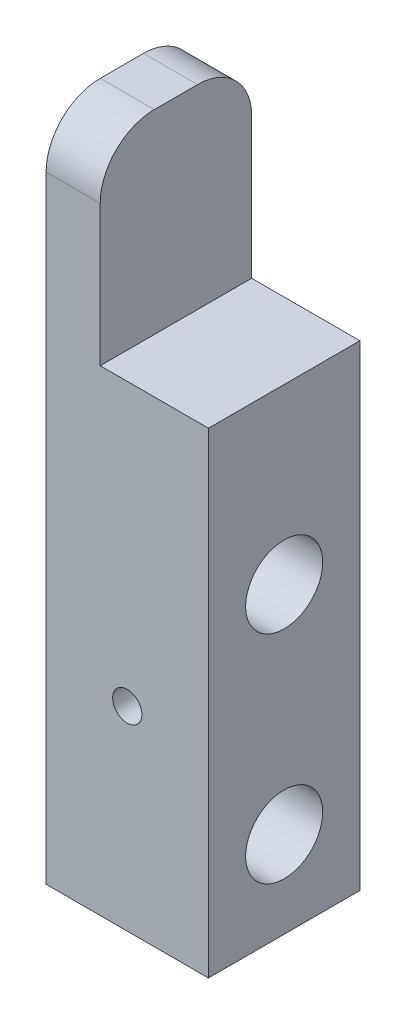
ISO-10303-21;
HEADER;
FILE_DESCRIPTION(('STEP AP214'),'2;1');
FILE_NAME('part.step','',(''),(''),'','','');
FILE_SCHEMA(('AUTOMOTIVE_DESIGN { 1 0 10303 214 1 1 1 1 }'));
ENDSEC;
DATA;
#1=APPLICATION_CONTEXT('core data for automotive mechanical design processes');
#2=APPLICATION_PROTOCOL_DEFINITION('international standard','automotive_design',2000,#1);
#3=PRODUCT_CONTEXT('',#1,'mechanical');
#4=PRODUCT('Part','Part','',(#3));
#5=PRODUCT_RELATED_PRODUCT_CATEGORY('part','',(#4));
#6=PRODUCT_DEFINITION_FORMATION('','',#4);
#7=PRODUCT_DEFINITION_CONTEXT('part definition',#1,'design');
#8=PRODUCT_DEFINITION('design','',#6,#7);
#9=PRODUCT_DEFINITION_SHAPE('','',#8);
#10=(LENGTH_UNIT() NAMED_UNIT(*) SI_UNIT(.MILLI.,.METRE.));
#11=(NAMED_UNIT(*) PLANE_ANGLE_UNIT() SI_UNIT($,.RADIAN.));
#12=(NAMED_UNIT(*) SI_UNIT($,.STERADIAN.) SOLID_ANGLE_UNIT());
#13=UNCERTAINTY_MEASURE_WITH_UNIT(LENGTH_MEASURE(1.E-05),#10,'distance_accuracy_value','');
#14=(GEOMETRIC_REPRESENTATION_CONTEXT(3) GLOBAL_UNCERTAINTY_ASSIGNED_CONTEXT((#13)) GLOBAL_UNIT_ASSIGNED_CONTEXT((#10,
#11,#12)) REPRESENTATION_CONTEXT('',''));
#15=CARTESIAN_POINT('',(0.,0.,0.));
#16=DIRECTION('',(0.,0.,1.));
#17=DIRECTION('',(1.,0.,0.));
#18=AXIS2_PLACEMENT_3D('',#15,#16,#17);
#19=CARTESIAN_POINT('',(-7.5,-18.,7.));
#20=DIRECTION('',(0.,1.,0.));
#21=DIRECTION('',(0.,0.,1.));
#22=AXIS2_PLACEMENT_3D('',#19,#20,#21);
#23=PLANE('',#22);
#24=DIRECTION('',(1.,0.,0.));
#25=VECTOR('',#24,1.);
#26=CARTESIAN_POINT('',(-7.5,-18.,-7.));
#27=LINE('',#26,#25);
#28=CARTESIAN_POINT('',(-7.5,-18.,-7.));
#29=VERTEX_POINT('',#28);
#30=CARTESIAN_POINT('',(7.5,-18.,-7.));
#31=VERTEX_POINT('',#30);
#32=EDGE_CURVE('E122',#29,#31,#27,.T.);
#33=ORIENTED_EDGE('',*,*,#32,.T.);
#34=DIRECTION('',(0.,0.,-1.));
#35=VECTOR('',#34,1.);
#36=CARTESIAN_POINT('',(7.5,-18.,7.));
#37=LINE('',#36,#35);
#38=CARTESIAN_POINT('',(7.5,-18.,7.));
#39=VERTEX_POINT('',#38);
#40=EDGE_CURVE('E106',#39,#31,#37,.T.);
#41=ORIENTED_EDGE('',*,*,#40,.F.);
#42=DIRECTION('',(1.,0.,0.));
#43=VECTOR('',#42,1.);
#44=CARTESIAN_POINT('',(-7.5,-18.,7.));
#45=LINE('',#44,#43);
#46=CARTESIAN_POINT('',(-7.5,-18.,7.));
#47=VERTEX_POINT('',#46);
#48=EDGE_CURVE('E112',#47,#39,#45,.T.);
#49=ORIENTED_EDGE('',*,*,#48,.F.);
#50=DIRECTION('',(0.,0.,-1.));
#51=VECTOR('',#50,1.);
#52=CARTESIAN_POINT('',(-7.5,-18.,7.));
#53=LINE('',#52,#51);
#54=EDGE_CURVE('E170',#47,#29,#53,.T.);
#55=ORIENTED_EDGE('',*,*,#54,.T.);
#56=EDGE_LOOP('',(#33,#41,#49,#55));
#57=FACE_BOUND('',#56,.T.);
#58=ADVANCED_FACE('F35',(#57),#23,.F.);
#59=CARTESIAN_POINT('',(7.5,23.,7.));
#60=DIRECTION('',(-1.,0.,0.));
#61=DIRECTION('',(0.,0.,1.));
#62=AXIS2_PLACEMENT_3D('',#59,#60,#61);
#63=PLANE('',#62);
#64=CARTESIAN_POINT('',(7.5,10.,0.));
#65=DIRECTION('',(1.,0.,0.));
#66=DIRECTION('',(0.,0.,-1.));
#67=AXIS2_PLACEMENT_3D('',#64,#65,#66);
#68=CIRCLE('',#67,3.56);
#69=CARTESIAN_POINT('',(7.5,10.,-3.56));
#70=VERTEX_POINT('',#69);
#71=EDGE_CURVE('E138',#70,#70,#68,.T.);
#72=ORIENTED_EDGE('',*,*,#71,.F.);
#73=EDGE_LOOP('',(#72));
#74=FACE_BOUND('',#73,.T.);
#75=CARTESIAN_POINT('',(7.5,-10.,0.));
#76=DIRECTION('',(1.,0.,0.));
#77=DIRECTION('',(0.,0.,-1.));
#78=AXIS2_PLACEMENT_3D('',#75,#76,#77);
#79=CIRCLE('',#78,3.56);
#80=CARTESIAN_POINT('',(7.5,-10.,-3.56));
#81=VERTEX_POINT('',#80);
#82=EDGE_CURVE('E135',#81,#81,#79,.T.);
#83=ORIENTED_EDGE('',*,*,#82,.F.);
#84=EDGE_LOOP('',(#83));
#85=FACE_BOUND('',#84,.T.);
#86=DIRECTION('',(0.,1.,0.));
#87=VECTOR('',#86,1.);
#88=CARTESIAN_POINT('',(7.5,23.,-7.));
#89=LINE('',#88,#87);
#90=CARTESIAN_POINT('',(7.5,26.,-7.));
#91=VERTEX_POINT('',#90);
#92=EDGE_CURVE('E178',#31,#91,#89,.T.);
#93=ORIENTED_EDGE('',*,*,#92,.T.);
#94=DIRECTION('',(0.,0.,-1.));
#95=VECTOR('',#94,1.);
#96=CARTESIAN_POINT('',(7.5,26.,7.));
#97=LINE('',#96,#95);
#98=CARTESIAN_POINT('',(7.5,26.,7.));
#99=VERTEX_POINT('',#98);
#100=EDGE_CURVE('E108',#99,#91,#97,.T.);
#101=ORIENTED_EDGE('',*,*,#100,.F.);
#102=DIRECTION('',(0.,1.,0.));
#103=VECTOR('',#102,1.);
#104=CARTESIAN_POINT('',(7.5,-18.,7.));
#105=LINE('',#104,#103);
#106=EDGE_CURVE('E101',#39,#99,#105,.T.);
#107=ORIENTED_EDGE('',*,*,#106,.F.);
#108=ORIENTED_EDGE('',*,*,#40,.T.);
#109=EDGE_LOOP('',(#93,#101,#107,#108));
#110=FACE_BOUND('',#109,.T.);
#111=ADVANCED_FACE('F104',(#74,#85,#110),#63,.F.);
#112=CARTESIAN_POINT('',(-2.5,26.,7.));
#113=DIRECTION('',(0.,1.,0.));
#114=DIRECTION('',(0.,0.,1.));
#115=AXIS2_PLACEMENT_3D('',#112,#113,#114);
#116=PLANE('',#115);
#117=DIRECTION('',(1.,0.,0.));
#118=VECTOR('',#117,1.);
#119=CARTESIAN_POINT('',(-2.5,26.,-7.));
#120=LINE('',#119,#118);
#121=CARTESIAN_POINT('',(-2.5,26.,-7.));
#122=VERTEX_POINT('',#121);
#123=EDGE_CURVE('E175',#122,#91,#120,.T.);
#124=ORIENTED_EDGE('',*,*,#123,.F.);
#125=DIRECTION('',(0.,0.,-1.));
#126=VECTOR('',#125,1.);
#127=CARTESIAN_POINT('',(-2.5,26.,7.));
#128=LINE('',#127,#126);
#129=CARTESIAN_POINT('',(-2.5,26.,7.));
#130=VERTEX_POINT('',#129);
#131=EDGE_CURVE('E128',#130,#122,#128,.T.);
#132=ORIENTED_EDGE('',*,*,#131,.F.);
#133=DIRECTION('',(1.,0.,0.));
#134=VECTOR('',#133,1.);
#135=CARTESIAN_POINT('',(-2.5,26.,7.));
#136=LINE('',#135,#134);
#137=EDGE_CURVE('E111',#130,#99,#136,.T.);
#138=ORIENTED_EDGE('',*,*,#137,.T.);
#139=ORIENTED_EDGE('',*,*,#100,.T.);
#140=EDGE_LOOP('',(#124,#132,#138,#139));
#141=FACE_BOUND('',#140,.T.);
#142=ADVANCED_FACE('F220',(#141),#116,.T.);
#143=CARTESIAN_POINT('',(-2.5,26.,7.));
#144=DIRECTION('',(-1.,0.,0.));
#145=DIRECTION('',(0.,0.,1.));
#146=AXIS2_PLACEMENT_3D('',#143,#144,#145);
#147=PLANE('',#146);
#148=DIRECTION('',(0.,1.,0.));
#149=VECTOR('',#148,1.);
#150=CARTESIAN_POINT('',(-2.5,26.,-7.));
#151=LINE('',#150,#149);
#152=CARTESIAN_POINT('',(-2.5,39.,-7.));
#153=VERTEX_POINT('',#152);
#154=EDGE_CURVE('E160',#122,#153,#151,.T.);
#155=ORIENTED_EDGE('',*,*,#154,.T.);
#156=CARTESIAN_POINT('',(-2.5,39.,-2.));
#157=DIRECTION('',(-1.,0.,0.));
#158=DIRECTION('',(0.,0.,1.));
#159=AXIS2_PLACEMENT_3D('',#156,#157,#158);
#160=CIRCLE('',#159,5.);
#161=CARTESIAN_POINT('',(-2.5,44.,-2.));
#162=VERTEX_POINT('',#161);
#163=EDGE_CURVE('E141',#153,#162,#160,.F.);
#164=ORIENTED_EDGE('',*,*,#163,.T.);
#165=DIRECTION('',(0.,0.,-1.));
#166=VECTOR('',#165,1.);
#167=CARTESIAN_POINT('',(-2.5,44.,7.));
#168=LINE('',#167,#166);
#169=CARTESIAN_POINT('',(-2.5,44.,2.));
#170=VERTEX_POINT('',#169);
#171=EDGE_CURVE('E166',#170,#162,#168,.T.);
#172=ORIENTED_EDGE('',*,*,#171,.F.);
#173=CARTESIAN_POINT('',(-2.5,39.,2.));
#174=DIRECTION('',(-1.,0.,0.));
#175=DIRECTION('',(0.,0.,1.));
#176=AXIS2_PLACEMENT_3D('',#173,#174,#175);
#177=CIRCLE('',#176,5.);
#178=CARTESIAN_POINT('',(-2.5,39.,7.));
#179=VERTEX_POINT('',#178);
#180=EDGE_CURVE('E126',#170,#179,#177,.F.);
#181=ORIENTED_EDGE('',*,*,#180,.T.);
#182=DIRECTION('',(0.,1.,0.));
#183=VECTOR('',#182,1.);
#184=CARTESIAN_POINT('',(-2.5,26.,7.));
#185=LINE('',#184,#183);
#186=EDGE_CURVE('E182',#130,#179,#185,.T.);
#187=ORIENTED_EDGE('',*,*,#186,.F.);
#188=ORIENTED_EDGE('',*,*,#131,.T.);
#189=EDGE_LOOP('',(#155,#164,#172,#181,#187,#188));
#190=FACE_BOUND('',#189,.T.);
#191=ADVANCED_FACE('F165',(#190),#147,.F.);
#192=CARTESIAN_POINT('',(-7.5,44.,7.));
#193=DIRECTION('',(0.,1.,0.));
#194=DIRECTION('',(0.,0.,1.));
#195=AXIS2_PLACEMENT_3D('',#192,#193,#194);
#196=PLANE('',#195);
#197=ORIENTED_EDGE('',*,*,#171,.T.);
#198=DIRECTION('',(1.,0.,0.));
#199=VECTOR('',#198,1.);
#200=CARTESIAN_POINT('',(-7.5,44.,-2.));
#201=LINE('',#200,#199);
#202=CARTESIAN_POINT('',(-7.5,44.,-2.));
#203=VERTEX_POINT('',#202);
#204=EDGE_CURVE('E56',#162,#203,#201,.F.);
#205=ORIENTED_EDGE('',*,*,#204,.T.);
#206=DIRECTION('',(0.,0.,-1.));
#207=VECTOR('',#206,1.);
#208=CARTESIAN_POINT('',(-7.5,44.,7.));
#209=LINE('',#208,#207);
#210=CARTESIAN_POINT('',(-7.5,44.,2.));
#211=VERTEX_POINT('',#210);
#212=EDGE_CURVE('E153',#211,#203,#209,.T.);
#213=ORIENTED_EDGE('',*,*,#212,.F.);
#214=DIRECTION('',(1.,0.,0.));
#215=VECTOR('',#214,1.);
#216=CARTESIAN_POINT('',(-7.5,44.,2.));
#217=LINE('',#216,#215);
#218=EDGE_CURVE('E143',#211,#170,#217,.T.);
#219=ORIENTED_EDGE('',*,*,#218,.T.);
#220=EDGE_LOOP('',(#197,#205,#213,#219));
#221=FACE_BOUND('',#220,.T.);
#222=ADVANCED_FACE('F167',(#221),#196,.T.);
#223=CARTESIAN_POINT('',(-7.5,-18.,7.));
#224=DIRECTION('',(-1.,0.,0.));
#225=DIRECTION('',(0.,0.,1.));
#226=AXIS2_PLACEMENT_3D('',#223,#224,#225);
#227=PLANE('',#226);
#228=CARTESIAN_POINT('',(-7.5,10.,0.));
#229=DIRECTION('',(-1.,0.,0.));
#230=DIRECTION('',(0.,0.,1.));
#231=AXIS2_PLACEMENT_3D('',#228,#229,#230);
#232=CIRCLE('',#231,3.56);
#233=CARTESIAN_POINT('',(-7.5,10.,3.56));
#234=VERTEX_POINT('',#233);
#235=EDGE_CURVE('E136',#234,#234,#232,.T.);
#236=ORIENTED_EDGE('',*,*,#235,.F.);
#237=EDGE_LOOP('',(#236));
#238=FACE_BOUND('',#237,.T.);
#239=CARTESIAN_POINT('',(-7.5,-10.,0.));
#240=DIRECTION('',(-1.,0.,0.));
#241=DIRECTION('',(0.,0.,1.));
#242=AXIS2_PLACEMENT_3D('',#239,#240,#241);
#243=CIRCLE('',#242,3.56);
#244=CARTESIAN_POINT('',(-7.5,-10.,3.56));
#245=VERTEX_POINT('',#244);
#246=EDGE_CURVE('E132',#245,#245,#243,.T.);
#247=ORIENTED_EDGE('',*,*,#246,.F.);
#248=EDGE_LOOP('',(#247));
#249=FACE_BOUND('',#248,.T.);
#250=ORIENTED_EDGE('',*,*,#212,.T.);
#251=CARTESIAN_POINT('',(-7.5,39.,-2.));
#252=DIRECTION('',(-1.,0.,0.));
#253=DIRECTION('',(0.,0.,1.));
#254=AXIS2_PLACEMENT_3D('',#251,#252,#253);
#255=CIRCLE('',#254,5.);
#256=CARTESIAN_POINT('',(-7.5,39.,-7.));
#257=VERTEX_POINT('',#256);
#258=EDGE_CURVE('E43',#203,#257,#255,.T.);
#259=ORIENTED_EDGE('',*,*,#258,.T.);
#260=DIRECTION('',(0.,1.,0.));
#261=VECTOR('',#260,1.);
#262=CARTESIAN_POINT('',(-7.5,-18.,-7.));
#263=LINE('',#262,#261);
#264=EDGE_CURVE('E119',#29,#257,#263,.T.);
#265=ORIENTED_EDGE('',*,*,#264,.F.);
#266=ORIENTED_EDGE('',*,*,#54,.F.);
#267=DIRECTION('',(0.,1.,0.));
#268=VECTOR('',#267,1.);
#269=CARTESIAN_POINT('',(-7.5,26.,7.));
#270=LINE('',#269,#268);
#271=CARTESIAN_POINT('',(-7.5,39.,7.));
#272=VERTEX_POINT('',#271);
#273=EDGE_CURVE('E116',#47,#272,#270,.T.);
#274=ORIENTED_EDGE('',*,*,#273,.T.);
#275=CARTESIAN_POINT('',(-7.5,39.,2.));
#276=DIRECTION('',(-1.,0.,0.));
#277=DIRECTION('',(0.,0.,1.));
#278=AXIS2_PLACEMENT_3D('',#275,#276,#277);
#279=CIRCLE('',#278,5.);
#280=EDGE_CURVE('E147',#272,#211,#279,.T.);
#281=ORIENTED_EDGE('',*,*,#280,.T.);
#282=EDGE_LOOP('',(#250,#259,#265,#266,#274,#281));
#283=FACE_BOUND('',#282,.T.);
#284=ADVANCED_FACE('F152',(#238,#249,#283),#227,.T.);
#285=CARTESIAN_POINT('',(0.,0.,7.));
#286=DIRECTION('',(0.,0.,1.));
#287=DIRECTION('',(1.,0.,0.));
#288=AXIS2_PLACEMENT_3D('',#285,#286,#287);
#289=PLANE('',#288);
#290=CARTESIAN_POINT('',(0.,0.,7.));
#291=DIRECTION('',(0.,0.,1.));
#292=DIRECTION('',(1.,0.,0.));
#293=AXIS2_PLACEMENT_3D('',#290,#291,#292);
#294=CIRCLE('',#293,1.35);
#295=CARTESIAN_POINT('',(1.35,0.,7.));
#296=VERTEX_POINT('',#295);
#297=EDGE_CURVE('E190',#296,#296,#294,.T.);
#298=ORIENTED_EDGE('',*,*,#297,.F.);
#299=EDGE_LOOP('',(#298));
#300=FACE_BOUND('',#299,.T.);
#301=ORIENTED_EDGE('',*,*,#186,.T.);
#302=DIRECTION('',(1.,0.,0.));
#303=VECTOR('',#302,1.);
#304=CARTESIAN_POINT('',(0.,39.,7.));
#305=LINE('',#304,#303);
#306=EDGE_CURVE('E11',#179,#272,#305,.F.);
#307=ORIENTED_EDGE('',*,*,#306,.T.);
#308=ORIENTED_EDGE('',*,*,#273,.F.);
#309=ORIENTED_EDGE('',*,*,#48,.T.);
#310=ORIENTED_EDGE('',*,*,#106,.T.);
#311=ORIENTED_EDGE('',*,*,#137,.F.);
#312=EDGE_LOOP('',(#301,#307,#308,#309,#310,#311));
#313=FACE_BOUND('',#312,.T.);
#314=ADVANCED_FACE('F115',(#300,#313),#289,.T.);
#315=CARTESIAN_POINT('',(0.,0.,-7.));
#316=DIRECTION('',(0.,0.,1.));
#317=DIRECTION('',(1.,0.,0.));
#318=AXIS2_PLACEMENT_3D('',#315,#316,#317);
#319=PLANE('',#318);
#320=CARTESIAN_POINT('',(0.,0.,-7.));
#321=DIRECTION('',(0.,0.,1.));
#322=DIRECTION('',(1.,0.,0.));
#323=AXIS2_PLACEMENT_3D('',#320,#321,#322);
#324=CIRCLE('',#323,1.35);
#325=CARTESIAN_POINT('',(1.35,0.,-7.));
#326=VERTEX_POINT('',#325);
#327=EDGE_CURVE('E189',#326,#326,#324,.T.);
#328=ORIENTED_EDGE('',*,*,#327,.T.);
#329=EDGE_LOOP('',(#328));
#330=FACE_BOUND('',#329,.T.);
#331=ORIENTED_EDGE('',*,*,#264,.T.);
#332=DIRECTION('',(1.,0.,0.));
#333=VECTOR('',#332,1.);
#334=CARTESIAN_POINT('',(-2.5,39.,-7.));
#335=LINE('',#334,#333);
#336=EDGE_CURVE('E123',#257,#153,#335,.T.);
#337=ORIENTED_EDGE('',*,*,#336,.T.);
#338=ORIENTED_EDGE('',*,*,#154,.F.);
#339=ORIENTED_EDGE('',*,*,#123,.T.);
#340=ORIENTED_EDGE('',*,*,#92,.F.);
#341=ORIENTED_EDGE('',*,*,#32,.F.);
#342=EDGE_LOOP('',(#331,#337,#338,#339,#340,#341));
#343=FACE_BOUND('',#342,.T.);
#344=ADVANCED_FACE('F157',(#330,#343),#319,.F.);
#345=CARTESIAN_POINT('',(-12.5,-10.,0.));
#346=DIRECTION('',(1.,0.,0.));
#347=DIRECTION('',(0.,0.,-1.));
#348=AXIS2_PLACEMENT_3D('',#345,#346,#347);
#349=CYLINDRICAL_SURFACE('',#348,3.56);
#350=ORIENTED_EDGE('',*,*,#246,.T.);
#351=EDGE_LOOP('',(#350));
#352=FACE_BOUND('',#351,.T.);
#353=ORIENTED_EDGE('',*,*,#82,.T.);
#354=EDGE_LOOP('',(#353));
#355=FACE_BOUND('',#354,.T.);
#356=ADVANCED_FACE('F210',(#352,#355),#349,.F.);
#357=CARTESIAN_POINT('',(-12.5,10.,0.));
#358=DIRECTION('',(1.,0.,0.));
#359=DIRECTION('',(0.,0.,-1.));
#360=AXIS2_PLACEMENT_3D('',#357,#358,#359);
#361=CYLINDRICAL_SURFACE('',#360,3.56);
#362=ORIENTED_EDGE('',*,*,#235,.T.);
#363=EDGE_LOOP('',(#362));
#364=FACE_BOUND('',#363,.T.);
#365=ORIENTED_EDGE('',*,*,#71,.T.);
#366=EDGE_LOOP('',(#365));
#367=FACE_BOUND('',#366,.T.);
#368=ADVANCED_FACE('F200',(#364,#367),#361,.F.);
#369=CARTESIAN_POINT('',(0.,0.,-7.));
#370=DIRECTION('',(0.,0.,1.));
#371=DIRECTION('',(1.,0.,0.));
#372=AXIS2_PLACEMENT_3D('',#369,#370,#371);
#373=CYLINDRICAL_SURFACE('',#372,1.35);
#374=ORIENTED_EDGE('',*,*,#327,.F.);
#375=EDGE_LOOP('',(#374));
#376=FACE_BOUND('',#375,.T.);
#377=ORIENTED_EDGE('',*,*,#297,.T.);
#378=EDGE_LOOP('',(#377));
#379=FACE_BOUND('',#378,.T.);
#380=ADVANCED_FACE('F197',(#376,#379),#373,.F.);
#381=CARTESIAN_POINT('',(0.,39.,-2.));
#382=DIRECTION('',(-1.,0.,0.));
#383=DIRECTION('',(0.,0.,1.));
#384=AXIS2_PLACEMENT_3D('',#381,#382,#383);
#385=CYLINDRICAL_SURFACE('',#384,5.);
#386=ORIENTED_EDGE('',*,*,#258,.F.);
#387=ORIENTED_EDGE('',*,*,#204,.F.);
#388=ORIENTED_EDGE('',*,*,#163,.F.);
#389=ORIENTED_EDGE('',*,*,#336,.F.);
#390=EDGE_LOOP('',(#386,#387,#388,#389));
#391=FACE_BOUND('',#390,.T.);
#392=ADVANCED_FACE('F162',(#391),#385,.T.);
#393=CARTESIAN_POINT('',(-7.5,39.,2.));
#394=DIRECTION('',(1.,0.,0.));
#395=DIRECTION('',(0.,0.,-1.));
#396=AXIS2_PLACEMENT_3D('',#393,#394,#395);
#397=CYLINDRICAL_SURFACE('',#396,5.);
#398=ORIENTED_EDGE('',*,*,#280,.F.);
#399=ORIENTED_EDGE('',*,*,#306,.F.);
#400=ORIENTED_EDGE('',*,*,#180,.F.);
#401=ORIENTED_EDGE('',*,*,#218,.F.);
#402=EDGE_LOOP('',(#398,#399,#400,#401));
#403=FACE_BOUND('',#402,.T.);
#404=ADVANCED_FACE('F37',(#403),#397,.T.);
#405=CLOSED_SHELL('',(#58,#111,#142,#191,#222,#284,#314,#344,#356,#368,#380,#392,#404));
#406=MANIFOLD_SOLID_BREP('B2',#405);
#407=ADVANCED_BREP_SHAPE_REPRESENTATION('',(#18,#406),#14);
#408=SHAPE_DEFINITION_REPRESENTATION(#9,#407);
ENDSEC;
END-ISO-10303-21;
